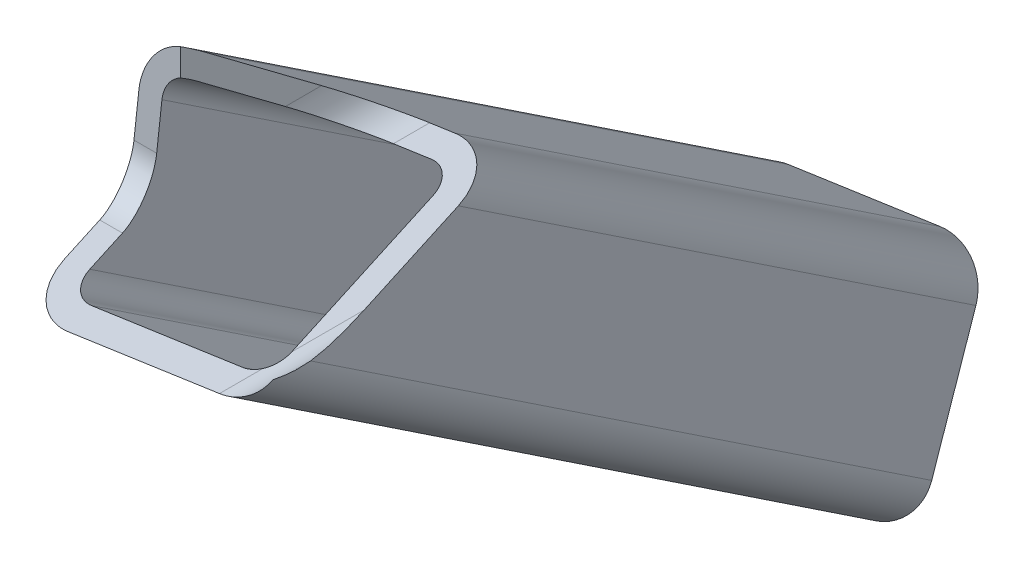
ISO-10303-21;
HEADER;
FILE_DESCRIPTION(('STEP AP214'),'2;1');
FILE_NAME('part.step','',(''),(''),'','','');
FILE_SCHEMA(('AUTOMOTIVE_DESIGN { 1 0 10303 214 1 1 1 1 }'));
ENDSEC;
DATA;
#1=APPLICATION_CONTEXT('core data for automotive mechanical design processes');
#2=APPLICATION_PROTOCOL_DEFINITION('international standard','automotive_design',2000,#1);
#3=PRODUCT_CONTEXT('',#1,'mechanical');
#4=PRODUCT('Part','Part','',(#3));
#5=PRODUCT_RELATED_PRODUCT_CATEGORY('part','',(#4));
#6=PRODUCT_DEFINITION_FORMATION('','',#4);
#7=PRODUCT_DEFINITION_CONTEXT('part definition',#1,'design');
#8=PRODUCT_DEFINITION('design','',#6,#7);
#9=PRODUCT_DEFINITION_SHAPE('','',#8);
#10=(LENGTH_UNIT() NAMED_UNIT(*) SI_UNIT(.MILLI.,.METRE.));
#11=(NAMED_UNIT(*) PLANE_ANGLE_UNIT() SI_UNIT($,.RADIAN.));
#12=(NAMED_UNIT(*) SI_UNIT($,.STERADIAN.) SOLID_ANGLE_UNIT());
#13=UNCERTAINTY_MEASURE_WITH_UNIT(LENGTH_MEASURE(1.E-05),#10,'distance_accuracy_value','');
#14=(GEOMETRIC_REPRESENTATION_CONTEXT(3) GLOBAL_UNCERTAINTY_ASSIGNED_CONTEXT((#13)) GLOBAL_UNIT_ASSIGNED_CONTEXT((#10,
#11,#12)) REPRESENTATION_CONTEXT('',''));
#15=CARTESIAN_POINT('',(0.,0.,0.));
#16=DIRECTION('',(0.,0.,1.));
#17=DIRECTION('',(1.,0.,0.));
#18=AXIS2_PLACEMENT_3D('',#15,#16,#17);
#19=CARTESIAN_POINT('',(143.018576029999,-3.96284793999886,-444.037152060001));
#20=DIRECTION('',(0.94907119849999,-0.101857603000022,-0.298142396999963));
#21=DIRECTION('',(-0.29970114592717,0.,-0.954033135236896));
#22=AXIS2_PLACEMENT_3D('',#19,#20,#21);
#23=PLANE('',#22);
#24=CARTESIAN_POINT('',(139.041918017913,-5.99999999999955,-456.));
#25=DIRECTION('',(0.94907119849999,-0.101857603000022,-0.298142396999963));
#26=DIRECTION('',(0.315061676783759,0.306829184502568,0.898104666149606));
#27=AXIS2_PLACEMENT_3D('',#24,#25,#26);
#28=ELLIPSE('',#27,4.21464691618714,4.);
#29=CARTESIAN_POINT('',(137.785353083812,-5.99999999999959,-460.));
#30=VERTEX_POINT('',#29);
#31=CARTESIAN_POINT('',(138.612624185538,-9.99999999999955,-456.));
#32=VERTEX_POINT('',#31);
#33=EDGE_CURVE('E220',#30,#32,#28,.F.);
#34=ORIENTED_EDGE('',*,*,#33,.T.);
#35=DIRECTION('',(0.29970114592717,0.,0.954033135236896));
#36=VECTOR('',#35,1.);
#37=CARTESIAN_POINT('',(142.428845393443,-9.99999999999943,-443.851893350385));
#38=LINE('',#37,#36);
#39=CARTESIAN_POINT('',(139.999999999999,-9.9999999999995,-451.583592135001));
#40=VERTEX_POINT('',#39);
#41=EDGE_CURVE('E228',#32,#40,#38,.T.);
#42=ORIENTED_EDGE('',*,*,#41,.T.);
#43=DIRECTION('',(-0.29814239699996,-0.596284793999952,-0.745355992499927));
#44=VECTOR('',#43,1.);
#45=CARTESIAN_POINT('',(143.018576029999,-3.96284793999886,-444.037152060001));
#46=LINE('',#45,#44);
#47=CARTESIAN_POINT('',(102.000000000001,-86.0000000000006,-546.583592135001));
#48=VERTEX_POINT('',#47);
#49=EDGE_CURVE('E335',#40,#48,#46,.T.);
#50=ORIENTED_EDGE('',*,*,#49,.T.);
#51=DIRECTION('',(0.,0.946298515400177,-0.323294169064988));
#52=VECTOR('',#51,1.);
#53=CARTESIAN_POINT('',(102.,-43.9096176049724,-560.963383480519));
#54=LINE('',#53,#52);
#55=CARTESIAN_POINT('',(102.000000000001,-74.0000000000007,-550.683281573));
#56=VERTEX_POINT('',#55);
#57=EDGE_CURVE('E343',#48,#56,#54,.T.);
#58=ORIENTED_EDGE('',*,*,#57,.T.);
#59=DIRECTION('',(-0.29814239699996,-0.596284793999952,-0.745355992499927));
#60=VECTOR('',#59,1.);
#61=CARTESIAN_POINT('',(141.796284793999,5.59256958800036,-451.192569588));
#62=LINE('',#61,#60);
#63=CARTESIAN_POINT('',(138.273312629199,-1.45337474159996,-460.));
#64=VERTEX_POINT('',#63);
#65=EDGE_CURVE('E344',#64,#56,#62,.T.);
#66=ORIENTED_EDGE('',*,*,#65,.F.);
#67=DIRECTION('',(-0.106710653684526,-0.994290116812101,0.));
#68=VECTOR('',#67,1.);
#69=CARTESIAN_POINT('',(138.06108923,-3.43079331316981,-460.));
#70=LINE('',#69,#68);
#71=EDGE_CURVE('E221',#64,#30,#70,.T.);
#72=ORIENTED_EDGE('',*,*,#71,.T.);
#73=EDGE_LOOP('',(#34,#42,#50,#58,#66,#72));
#74=FACE_BOUND('',#73,.T.);
#75=ADVANCED_FACE('F41',(#74),#23,.T.);
#76=CARTESIAN_POINT('',(144.916718426999,-4.16656314599899,-444.633436854001));
#77=DIRECTION('',(-0.29814239699996,-0.596284793999952,-0.745355992499927));
#78=DIRECTION('',(0.,0.780868809443026,-0.62469504755443));
#79=AXIS2_PLACEMENT_3D('',#76,#77,#78);
#80=CYLINDRICAL_SURFACE('',#79,2.);
#81=ORIENTED_EDGE('',*,*,#49,.F.);
#82=CARTESIAN_POINT('',(141.999999999999,-9.99999999999949,-451.925232921501));
#83=DIRECTION('',(0.,1.,0.));
#84=DIRECTION('',(-0.371390676354096,0.,-0.928476690885262));
#85=AXIS2_PLACEMENT_3D('',#82,#83,#84);
#86=ELLIPSE('',#85,3.35410196624969,2.);
#87=CARTESIAN_POINT('',(142.999999999999,-9.99999999999946,-448.741951348501));
#88=VERTEX_POINT('',#87);
#89=EDGE_CURVE('E234',#40,#88,#86,.T.);
#90=ORIENTED_EDGE('',*,*,#89,.T.);
#91=DIRECTION('',(-0.29814239699996,-0.596284793999952,-0.745355992499927));
#92=VECTOR('',#91,1.);
#93=CARTESIAN_POINT('',(145.120433632999,-5.75913273399889,-443.440867266001));
#94=LINE('',#93,#92);
#95=CARTESIAN_POINT('',(104.000000000001,-88.0000000000007,-546.241951348501));
#96=VERTEX_POINT('',#95);
#97=EDGE_CURVE('E327',#88,#96,#94,.T.);
#98=ORIENTED_EDGE('',*,*,#97,.T.);
#99=CARTESIAN_POINT('',(104.000000000001,-86.0000000000006,-546.925232921501));
#100=DIRECTION('',(-0.159575689721222,-0.319151379442473,-0.934172358962714));
#101=DIRECTION('',(-0.417774579468388,-0.835549158936788,0.356822089773093));
#102=AXIS2_PLACEMENT_3D('',#99,#100,#101);
#103=ELLIPSE('',#102,2.14093253863854,2.);
#104=EDGE_CURVE('E333',#96,#48,#103,.T.);
#105=ORIENTED_EDGE('',*,*,#104,.T.);
#106=EDGE_LOOP('',(#81,#90,#98,#105));
#107=FACE_BOUND('',#106,.T.);
#108=ADVANCED_FACE('F311',(#107),#80,.F.);
#109=CARTESIAN_POINT('',(145.120433632999,-5.75913273399889,-443.440867266001));
#110=DIRECTION('',(-0.10185760300003,0.796284793999938,-0.596284793999951));
#111=DIRECTION('',(0.,0.599402291854362,0.800447932422677));
#112=AXIS2_PLACEMENT_3D('',#109,#110,#111);
#113=PLANE('',#112);
#114=ORIENTED_EDGE('',*,*,#97,.F.);
#115=DIRECTION('',(0.985721919281303,0.,-0.168381405886707));
#116=VECTOR('',#115,1.);
#117=CARTESIAN_POINT('',(144.18045514836,-9.99999999999945,-448.943597161158));
#118=LINE('',#117,#116);
#119=CARTESIAN_POINT('',(154.999999999999,-9.99999999999933,-450.7917960675));
#120=VERTEX_POINT('',#119);
#121=EDGE_CURVE('E267',#88,#120,#118,.T.);
#122=ORIENTED_EDGE('',*,*,#121,.T.);
#123=DIRECTION('',(-0.29814239699996,-0.596284793999952,-0.745355992499927));
#124=VECTOR('',#123,1.);
#125=CARTESIAN_POINT('',(156.509288014999,-6.98142396999907,-447.01857603));
#126=LINE('',#125,#124);
#127=CARTESIAN_POINT('',(116.000000000001,-88.0000000000006,-548.2917960675));
#128=VERTEX_POINT('',#127);
#129=EDGE_CURVE('E337',#120,#128,#126,.T.);
#130=ORIENTED_EDGE('',*,*,#129,.T.);
#131=DIRECTION('',(-0.985721919281303,0.,0.168381405886707));
#132=VECTOR('',#131,1.);
#133=CARTESIAN_POINT('',(126.891934380536,-88.0000000000006,-550.152360581636));
#134=LINE('',#133,#132);
#135=EDGE_CURVE('E330',#128,#96,#134,.T.);
#136=ORIENTED_EDGE('',*,*,#135,.T.);
#137=EDGE_LOOP('',(#114,#122,#130,#136));
#138=FACE_BOUND('',#137,.T.);
#139=ADVANCED_FACE('F314',(#138),#113,.T.);
#140=CARTESIAN_POINT('',(143.694427190999,5.38885438200044,-451.788854382));
#141=DIRECTION('',(-0.29814239699996,-0.596284793999952,-0.745355992499927));
#142=DIRECTION('',(0.,0.780868809443026,-0.62469504755443));
#143=AXIS2_PLACEMENT_3D('',#140,#141,#142);
#144=CYLINDRICAL_SURFACE('',#143,2.);
#145=CARTESIAN_POINT('',(139.999999999999,-1.99999999999939,-461.0249223595));
#146=DIRECTION('',(1.,0.,0.));
#147=DIRECTION('',(0.,-0.62469504755443,-0.780868809443026));
#148=AXIS2_PLACEMENT_3D('',#145,#146,#147);
#149=ELLIPSE('',#148,6.70820393249939,2.);
#150=CARTESIAN_POINT('',(139.999999999999,3.88578058618805E-13,-461.7082039325));
#151=VERTEX_POINT('',#150);
#152=CARTESIAN_POINT('',(139.999999999999,1.15266891727499,-460.));
#153=VERTEX_POINT('',#152);
#154=EDGE_CURVE('E296',#151,#153,#149,.T.);
#155=ORIENTED_EDGE('',*,*,#154,.T.);
#156=CARTESIAN_POINT('',(140.409968943799,-1.18006211239989,-460.));
#157=DIRECTION('',(0.,0.,1.));
#158=DIRECTION('',(-0.447213595499949,-0.89442719099992,0.));
#159=AXIS2_PLACEMENT_3D('',#156,#157,#158);
#160=ELLIPSE('',#159,2.68328157299975,2.);
#161=EDGE_CURVE('E247',#153,#64,#160,.T.);
#162=ORIENTED_EDGE('',*,*,#161,.T.);
#163=ORIENTED_EDGE('',*,*,#65,.T.);
#164=CARTESIAN_POINT('',(104.000000000001,-74.0000000000006,-551.0249223595));
#165=DIRECTION('',(-0.159575689721222,-0.319151379442473,-0.934172358962714));
#166=DIRECTION('',(-0.417774579468388,-0.835549158936788,0.356822089773093));
#167=AXIS2_PLACEMENT_3D('',#164,#165,#166);
#168=ELLIPSE('',#167,2.14093253863854,2.);
#169=CARTESIAN_POINT('',(104.000000000001,-72.0000000000007,-551.708203932499));
#170=VERTEX_POINT('',#169);
#171=EDGE_CURVE('E346',#56,#170,#168,.T.);
#172=ORIENTED_EDGE('',*,*,#171,.T.);
#173=DIRECTION('',(-0.29814239699996,-0.596284793999952,-0.745355992499927));
#174=VECTOR('',#173,1.);
#175=CARTESIAN_POINT('',(143.490711984999,6.98142397000013,-452.98142397));
#176=LINE('',#175,#174);
#177=EDGE_CURVE('E64',#151,#170,#176,.T.);
#178=ORIENTED_EDGE('',*,*,#177,.F.);
#179=EDGE_LOOP('',(#155,#162,#163,#172,#178));
#180=FACE_BOUND('',#179,.T.);
#181=ADVANCED_FACE('F317',(#180),#144,.F.);
#182=CARTESIAN_POINT('',(144.916718426999,-4.16656314599899,-444.633436854001));
#183=DIRECTION('',(-0.29814239699996,-0.596284793999952,-0.745355992499927));
#184=DIRECTION('',(0.,0.780868809443026,-0.62469504755443));
#185=AXIS2_PLACEMENT_3D('',#182,#183,#184);
#186=CYLINDRICAL_SURFACE('',#185,4.);
#187=CARTESIAN_POINT('',(141.999999999999,-9.99999999999949,-451.925232921501));
#188=DIRECTION('',(0.,1.,0.));
#189=DIRECTION('',(-0.371390676354096,0.,-0.928476690885262));
#190=AXIS2_PLACEMENT_3D('',#187,#188,#189);
#191=ELLIPSE('',#190,6.70820393249937,4.);
#192=CARTESIAN_POINT('',(137.999999999999,-9.99999999999952,-451.241951348501));
#193=VERTEX_POINT('',#192);
#194=CARTESIAN_POINT('',(143.999999999999,-9.99999999999942,-445.558669775502));
#195=VERTEX_POINT('',#194);
#196=EDGE_CURVE('E235',#193,#195,#191,.T.);
#197=ORIENTED_EDGE('',*,*,#196,.F.);
#198=DIRECTION('',(-0.29814239699996,-0.596284793999952,-0.745355992499927));
#199=VECTOR('',#198,1.);
#200=CARTESIAN_POINT('',(141.120433632999,-3.75913273399892,-443.440867266001));
#201=LINE('',#200,#199);
#202=CARTESIAN_POINT('',(100.000000000001,-86.0000000000007,-546.241951348501));
#203=VERTEX_POINT('',#202);
#204=EDGE_CURVE('E233',#193,#203,#201,.T.);
#205=ORIENTED_EDGE('',*,*,#204,.T.);
#206=CARTESIAN_POINT('',(104.000000000001,-86.0000000000006,-546.925232921501));
#207=DIRECTION('',(-0.159575689721222,-0.319151379442473,-0.934172358962714));
#208=DIRECTION('',(-0.417774579468388,-0.835549158936788,0.356822089773093));
#209=AXIS2_PLACEMENT_3D('',#206,#207,#208);
#210=ELLIPSE('',#209,4.28186507727708,4.);
#211=CARTESIAN_POINT('',(104.000000000001,-90.0000000000006,-545.558669775501));
#212=VERTEX_POINT('',#211);
#213=EDGE_CURVE('E359',#212,#203,#210,.T.);
#214=ORIENTED_EDGE('',*,*,#213,.F.);
#215=DIRECTION('',(-0.29814239699996,-0.596284793999952,-0.745355992499927));
#216=VECTOR('',#215,1.);
#217=CARTESIAN_POINT('',(145.324148838999,-7.35170232199857,-442.248297678001));
#218=LINE('',#217,#216);
#219=EDGE_CURVE('E108',#195,#212,#218,.T.);
#220=ORIENTED_EDGE('',*,*,#219,.F.);
#221=EDGE_LOOP('',(#197,#205,#214,#220));
#222=FACE_BOUND('',#221,.T.);
#223=ADVANCED_FACE('F322',(#222),#186,.T.);
#224=CARTESIAN_POINT('',(141.120433632999,-3.75913273399892,-443.440867266001));
#225=DIRECTION('',(0.94907119849999,-0.101857603000022,-0.298142396999963));
#226=DIRECTION('',(-0.29970114592717,0.,-0.954033135236896));
#227=AXIS2_PLACEMENT_3D('',#224,#225,#226);
#228=PLANE('',#227);
#229=DIRECTION('',(0.29970114592717,0.,0.954033135236896));
#230=VECTOR('',#229,1.);
#231=CARTESIAN_POINT('',(140.510803365472,-9.99999999999945,-443.249357261765));
#232=LINE('',#231,#230);
#233=CARTESIAN_POINT('',(136.505300727445,-9.99999999999957,-456.));
#234=VERTEX_POINT('',#233);
#235=EDGE_CURVE('E225',#234,#193,#232,.T.);
#236=ORIENTED_EDGE('',*,*,#235,.F.);
#237=CARTESIAN_POINT('',(136.934594559819,-5.99999999999956,-456.));
#238=DIRECTION('',(0.94907119849999,-0.101857603000022,-0.298142396999963));
#239=DIRECTION('',(0.315061676783759,0.306829184502568,0.898104666149606));
#240=AXIS2_PLACEMENT_3D('',#237,#238,#239);
#241=ELLIPSE('',#240,4.21464691618714,4.);
#242=CARTESIAN_POINT('',(135.678029625718,-5.9999999999996,-460.));
#243=VERTEX_POINT('',#242);
#244=EDGE_CURVE('E210',#243,#234,#241,.F.);
#245=ORIENTED_EDGE('',*,*,#244,.F.);
#246=DIRECTION('',(-0.106710653684526,-0.994290116812101,0.));
#247=VECTOR('',#246,1.);
#248=CARTESIAN_POINT('',(135.977762208902,-3.20720345292599,-460.));
#249=LINE('',#248,#247);
#250=CARTESIAN_POINT('',(136.136656314599,-1.7266873707998,-460.));
#251=VERTEX_POINT('',#250);
#252=EDGE_CURVE('E245',#251,#243,#249,.T.);
#253=ORIENTED_EDGE('',*,*,#252,.F.);
#254=DIRECTION('',(-0.29814239699996,-0.596284793999952,-0.745355992499927));
#255=VECTOR('',#254,1.);
#256=CARTESIAN_POINT('',(139.898142396999,5.7962847940005,-450.596284794));
#257=LINE('',#256,#255);
#258=CARTESIAN_POINT('',(100.000000000001,-74.0000000000007,-550.3416407865));
#259=VERTEX_POINT('',#258);
#260=EDGE_CURVE('E398',#251,#259,#257,.T.);
#261=ORIENTED_EDGE('',*,*,#260,.T.);
#262=DIRECTION('',(0.,0.946298515400177,-0.323294169064988));
#263=VECTOR('',#262,1.);
#264=CARTESIAN_POINT('',(100.,-43.8050984852211,-560.657450688296));
#265=LINE('',#264,#263);
#266=EDGE_CURVE('E353',#203,#259,#265,.T.);
#267=ORIENTED_EDGE('',*,*,#266,.F.);
#268=ORIENTED_EDGE('',*,*,#204,.F.);
#269=EDGE_LOOP('',(#236,#245,#253,#261,#267,#268));
#270=FACE_BOUND('',#269,.T.);
#271=ADVANCED_FACE('F231',(#270),#228,.F.);
#272=CARTESIAN_POINT('',(143.694427190999,5.38885438200044,-451.788854382));
#273=DIRECTION('',(-0.29814239699996,-0.596284793999952,-0.745355992499927));
#274=DIRECTION('',(0.,0.780868809443026,-0.62469504755443));
#275=AXIS2_PLACEMENT_3D('',#272,#273,#274);
#276=CYLINDRICAL_SURFACE('',#275,4.);
#277=CARTESIAN_POINT('',(140.409968943799,-1.18006211239989,-460.));
#278=DIRECTION('',(0.,0.,1.));
#279=DIRECTION('',(-0.447213595499949,-0.89442719099992,0.));
#280=AXIS2_PLACEMENT_3D('',#277,#278,#279);
#281=ELLIPSE('',#280,5.3665631459995,4.);
#282=CARTESIAN_POINT('',(139.999999999999,3.66695933993934,-460.));
#283=VERTEX_POINT('',#282);
#284=EDGE_CURVE('E243',#283,#251,#281,.T.);
#285=ORIENTED_EDGE('',*,*,#284,.F.);
#286=CARTESIAN_POINT('',(139.999999999999,-1.99999999999939,-461.0249223595));
#287=DIRECTION('',(1.,0.,0.));
#288=DIRECTION('',(0.,-0.62469504755443,-0.780868809443026));
#289=AXIS2_PLACEMENT_3D('',#286,#287,#288);
#290=ELLIPSE('',#289,13.4164078649988,4.);
#291=CARTESIAN_POINT('',(139.999999999999,2.00000000000038,-462.391485505499));
#292=VERTEX_POINT('',#291);
#293=EDGE_CURVE('E461',#292,#283,#290,.T.);
#294=ORIENTED_EDGE('',*,*,#293,.F.);
#295=DIRECTION('',(-0.29814239699996,-0.596284793999952,-0.745355992499927));
#296=VECTOR('',#295,1.);
#297=CARTESIAN_POINT('',(143.286996778999,8.57399355800002,-454.173993558));
#298=LINE('',#297,#296);
#299=CARTESIAN_POINT('',(104.000000000001,-70.0000000000008,-552.391485505499));
#300=VERTEX_POINT('',#299);
#301=EDGE_CURVE('E395',#292,#300,#298,.T.);
#302=ORIENTED_EDGE('',*,*,#301,.T.);
#303=CARTESIAN_POINT('',(104.000000000001,-74.0000000000006,-551.0249223595));
#304=DIRECTION('',(-0.159575689721222,-0.319151379442473,-0.934172358962714));
#305=DIRECTION('',(-0.417774579468388,-0.835549158936788,0.356822089773093));
#306=AXIS2_PLACEMENT_3D('',#303,#304,#305);
#307=ELLIPSE('',#306,4.28186507727708,4.);
#308=EDGE_CURVE('E348',#259,#300,#307,.T.);
#309=ORIENTED_EDGE('',*,*,#308,.F.);
#310=ORIENTED_EDGE('',*,*,#260,.F.);
#311=EDGE_LOOP('',(#285,#294,#302,#309,#310));
#312=FACE_BOUND('',#311,.T.);
#313=ADVANCED_FACE('F458',(#312),#276,.T.);
#314=CARTESIAN_POINT('',(140.000000000002,5.99999999999772,-825.));
#315=DIRECTION('',(1.,0.,0.));
#316=DIRECTION('',(0.,0.,-1.));
#317=AXIS2_PLACEMENT_3D('',#314,#315,#316);
#318=PLANE('',#317);
#319=ORIENTED_EDGE('',*,*,#293,.T.);
#320=DIRECTION('',(0.,-1.,0.));
#321=VECTOR('',#320,1.);
#322=CARTESIAN_POINT('',(139.999999999999,6.00000000000045,-460.));
#323=LINE('',#322,#321);
#324=EDGE_CURVE('E11',#283,#153,#323,.T.);
#325=ORIENTED_EDGE('',*,*,#324,.T.);
#326=ORIENTED_EDGE('',*,*,#154,.F.);
#327=DIRECTION('',(0.,0.599402291854362,0.800447932422677));
#328=VECTOR('',#327,1.);
#329=CARTESIAN_POINT('',(139.999999999999,4.53963364989105,-455.645930867494));
#330=LINE('',#329,#328);
#331=CARTESIAN_POINT('',(139.999999999999,-5.99999999999963,-469.720665112249));
#332=VERTEX_POINT('',#331);
#333=EDGE_CURVE('E463',#332,#151,#330,.T.);
#334=ORIENTED_EDGE('',*,*,#333,.F.);
#335=DIRECTION('',(0.,0.,1.));
#336=VECTOR('',#335,1.);
#337=CARTESIAN_POINT('',(140.000000000002,-6.0000000000023,-825.));
#338=LINE('',#337,#336);
#339=CARTESIAN_POINT('',(139.999999999999,-5.99999999999964,-473.074767078499));
#340=VERTEX_POINT('',#339);
#341=EDGE_CURVE('E253',#340,#332,#338,.T.);
#342=ORIENTED_EDGE('',*,*,#341,.F.);
#343=DIRECTION('',(0.,0.599402291854362,0.800447932422677));
#344=VECTOR('',#343,1.);
#345=CARTESIAN_POINT('',(139.999999999999,6.14889932304617,-456.851003044734));
#346=LINE('',#345,#344);
#347=EDGE_CURVE('E437',#340,#292,#346,.T.);
#348=ORIENTED_EDGE('',*,*,#347,.T.);
#349=EDGE_LOOP('',(#319,#325,#326,#334,#342,#348));
#350=FACE_BOUND('',#349,.T.);
#351=ADVANCED_FACE('F467',(#350),#318,.T.);
#352=CARTESIAN_POINT('',(156.305572808999,-5.38885438199918,-448.211145618));
#353=DIRECTION('',(-0.29814239699996,-0.596284793999952,-0.745355992499927));
#354=DIRECTION('',(0.,0.780868809443026,-0.62469504755443));
#355=AXIS2_PLACEMENT_3D('',#352,#353,#354);
#356=CYLINDRICAL_SURFACE('',#355,2.);
#357=CARTESIAN_POINT('',(153.999999999999,-9.99999999999939,-453.9750776405));
#358=DIRECTION('',(0.,1.,0.));
#359=DIRECTION('',(-0.371390676354096,0.,-0.928476690885262));
#360=AXIS2_PLACEMENT_3D('',#357,#358,#359);
#361=ELLIPSE('',#360,3.35410196624969,2.);
#362=CARTESIAN_POINT('',(155.999999999999,-9.99999999999936,-451.633436854));
#363=VERTEX_POINT('',#362);
#364=EDGE_CURVE('E270',#120,#363,#361,.T.);
#365=ORIENTED_EDGE('',*,*,#364,.T.);
#366=CARTESIAN_POINT('',(155.999999999999,-9.99999999999936,-451.633436854));
#367=CARTESIAN_POINT('',(156.03591201834,-9.99996142837952,-451.711793190897));
#368=CARTESIAN_POINT('',(156.067259781264,-9.99951647332164,-451.792112938987));
#369=CARTESIAN_POINT('',(156.121412114332,-9.99825837124838,-451.955341523659));
#370=CARTESIAN_POINT('',(156.144240934134,-9.99744628411695,-452.038242272018));
#371=CARTESIAN_POINT('',(156.181937809571,-9.9959014467898,-452.204867708711));
#372=CARTESIAN_POINT('',(156.196887844746,-9.99516794553557,-452.288574293103));
#373=CARTESIAN_POINT('',(156.219968393148,-9.99396410249764,-452.456974533567));
#374=CARTESIAN_POINT('',(156.228093004083,-9.99349398859521,-452.541668979867));
#375=CARTESIAN_POINT('',(156.240254773992,-9.99278540542814,-452.745289809075));
#376=CARTESIAN_POINT('',(156.241367468857,-9.99271421212924,-452.864390901013));
#377=CARTESIAN_POINT('',(156.23335638771,-9.9931881962528,-453.102228722222));
#378=CARTESIAN_POINT('',(156.224229077634,-9.99373358647304,-453.220965311509));
#379=CARTESIAN_POINT('',(156.196994023183,-9.99516941019323,-453.457887806276));
#380=CARTESIAN_POINT('',(156.178848318303,-9.99606129868996,-453.576069233935));
#381=CARTESIAN_POINT('',(156.134502730167,-9.99779954122553,-453.810850243259));
#382=CARTESIAN_POINT('',(156.108306538892,-9.99864591592853,-453.927450524502));
#383=CARTESIAN_POINT('',(156.06645803235,-9.99946547853923,-454.089082340905));
#384=CARTESIAN_POINT('',(156.05395025648,-9.99965760678938,-454.134947266496));
#385=CARTESIAN_POINT('',(156.027815874046,-9.99992452627933,-454.226172067096));
#386=CARTESIAN_POINT('',(156.014193625858,-9.99999975357614,-454.271533189319));
#387=CARTESIAN_POINT('',(155.999999999999,-9.99999999999938,-454.316718427));
#388=B_SPLINE_CURVE_WITH_KNOTS('',3,(#366,#367,#368,#369,#370,#371,#372,#373,#374,#375,#376,
#377,#378,#379,#380,#381,#382,#383,#384,#385,#386,#387),.UNSPECIFIED.,.F.,.F.,(4,2,2,2,2,2,2,2,
2,2,4),(0.,0.258270532872217,0.515800172061258,0.770594469002367,1.02560887345454,
1.38237703092867,1.73926835526132,2.09767480488864,2.45591713273812,2.5985257643496,
2.74060115777448),.UNSPECIFIED.);
#389=CARTESIAN_POINT('',(155.999999999999,-9.99999999999938,-454.316718427));
#390=VERTEX_POINT('',#389);
#391=EDGE_CURVE('E287',#363,#390,#388,.T.);
#392=ORIENTED_EDGE('',*,*,#391,.T.);
#393=DIRECTION('',(-0.29814239699996,-0.596284793999952,-0.745355992499927));
#394=VECTOR('',#393,1.);
#395=CARTESIAN_POINT('',(158.203715205999,-5.59256958799931,-448.807430412));
#396=LINE('',#395,#394);
#397=CARTESIAN_POINT('',(118.000000000001,-86.0000000000006,-549.316718427));
#398=VERTEX_POINT('',#397);
#399=EDGE_CURVE('E386',#390,#398,#396,.T.);
#400=ORIENTED_EDGE('',*,*,#399,.T.);
#401=CARTESIAN_POINT('',(116.000000000001,-86.0000000000005,-548.9750776405));
#402=DIRECTION('',(-0.159575689721222,-0.319151379442473,-0.934172358962714));
#403=DIRECTION('',(-0.417774579468388,-0.835549158936788,0.356822089773093));
#404=AXIS2_PLACEMENT_3D('',#401,#402,#403);
#405=ELLIPSE('',#404,2.14093253863854,2.);
#406=EDGE_CURVE('E387',#398,#128,#405,.T.);
#407=ORIENTED_EDGE('',*,*,#406,.T.);
#408=ORIENTED_EDGE('',*,*,#129,.F.);
#409=EDGE_LOOP('',(#365,#392,#400,#407,#408));
#410=FACE_BOUND('',#409,.T.);
#411=ADVANCED_FACE('F298',(#410),#356,.F.);
#412=CARTESIAN_POINT('',(156.981423969999,3.96284794000012,-455.96284794));
#413=DIRECTION('',(-0.94907119849999,0.101857603000022,0.298142396999963));
#414=DIRECTION('',(0.29970114592717,0.,0.954033135236896));
#415=AXIS2_PLACEMENT_3D('',#412,#413,#414);
#416=PLANE('',#415);
#417=ORIENTED_EDGE('',*,*,#399,.F.);
#418=DIRECTION('',(-0.29970114592717,0.,-0.954033135236896));
#419=VECTOR('',#418,1.);
#420=CARTESIAN_POINT('',(155.617482972331,-9.9999999999994,-455.534377832536));
#421=LINE('',#420,#419);
#422=CARTESIAN_POINT('',(149.999999999999,-9.99999999999956,-473.416407864999));
#423=VERTEX_POINT('',#422);
#424=EDGE_CURVE('E273',#390,#423,#421,.T.);
#425=ORIENTED_EDGE('',*,*,#424,.T.);
#426=DIRECTION('',(-0.29814239699996,-0.596284793999952,-0.745355992499927));
#427=VECTOR('',#426,1.);
#428=CARTESIAN_POINT('',(156.981423969999,3.96284794000012,-455.96284794));
#429=LINE('',#428,#427);
#430=CARTESIAN_POINT('',(118.000000000001,-74.0000000000005,-553.416407864999));
#431=VERTEX_POINT('',#430);
#432=EDGE_CURVE('E382',#423,#431,#429,.T.);
#433=ORIENTED_EDGE('',*,*,#432,.T.);
#434=DIRECTION('',(0.,-0.946298515400177,0.323294169064988));
#435=VECTOR('',#434,1.);
#436=CARTESIAN_POINT('',(118.,-34.0000000000005,-567.082039324994));
#437=LINE('',#436,#435);
#438=EDGE_CURVE('E383',#431,#398,#437,.T.);
#439=ORIENTED_EDGE('',*,*,#438,.T.);
#440=EDGE_LOOP('',(#417,#425,#433,#439));
#441=FACE_BOUND('',#440,.T.);
#442=ADVANCED_FACE('F416',(#441),#416,.T.);
#443=CARTESIAN_POINT('',(155.083281572999,4.16656314600003,-455.366563146));
#444=DIRECTION('',(-0.29814239699996,-0.596284793999952,-0.745355992499927));
#445=DIRECTION('',(0.,0.780868809443026,-0.62469504755443));
#446=AXIS2_PLACEMENT_3D('',#443,#444,#445);
#447=CYLINDRICAL_SURFACE('',#446,2.);
#448=ORIENTED_EDGE('',*,*,#432,.F.);
#449=CARTESIAN_POINT('',(147.999999999999,-9.9999999999996,-473.074767078499));
#450=DIRECTION('',(0.,1.,0.));
#451=DIRECTION('',(-0.371390676354096,0.,-0.928476690885262));
#452=AXIS2_PLACEMENT_3D('',#449,#450,#451);
#453=ELLIPSE('',#452,3.35410196624969,2.);
#454=CARTESIAN_POINT('',(146.999999999999,-9.99999999999963,-476.258048651499));
#455=VERTEX_POINT('',#454);
#456=EDGE_CURVE('E275',#423,#455,#453,.T.);
#457=ORIENTED_EDGE('',*,*,#456,.T.);
#458=DIRECTION('',(-0.29814239699996,-0.596284793999952,-0.745355992499927));
#459=VECTOR('',#458,1.);
#460=CARTESIAN_POINT('',(154.879566366999,5.75913273399993,-456.559132734));
#461=LINE('',#460,#459);
#462=CARTESIAN_POINT('',(116.000000000001,-72.0000000000006,-553.758048651499));
#463=VERTEX_POINT('',#462);
#464=EDGE_CURVE('E378',#455,#463,#461,.T.);
#465=ORIENTED_EDGE('',*,*,#464,.T.);
#466=CARTESIAN_POINT('',(116.000000000001,-74.0000000000006,-553.074767078499));
#467=DIRECTION('',(-0.159575689721222,-0.319151379442473,-0.934172358962714));
#468=DIRECTION('',(-0.417774579468388,-0.835549158936788,0.356822089773093));
#469=AXIS2_PLACEMENT_3D('',#466,#467,#468);
#470=ELLIPSE('',#469,2.14093253863854,2.);
#471=EDGE_CURVE('E379',#463,#431,#470,.T.);
#472=ORIENTED_EDGE('',*,*,#471,.T.);
#473=EDGE_LOOP('',(#448,#457,#465,#472));
#474=FACE_BOUND('',#473,.T.);
#475=ADVANCED_FACE('F421',(#474),#447,.F.);
#476=CARTESIAN_POINT('',(154.879566366999,5.75913273399993,-456.559132734));
#477=DIRECTION('',(0.10185760300003,-0.796284793999938,0.596284793999951));
#478=DIRECTION('',(0.,-0.599402291854362,-0.800447932422677));
#479=AXIS2_PLACEMENT_3D('',#476,#477,#478);
#480=PLANE('',#479);
#481=ORIENTED_EDGE('',*,*,#464,.F.);
#482=DIRECTION('',(-0.985721919281303,0.,0.168381405886707));
#483=VECTOR('',#482,1.);
#484=CARTESIAN_POINT('',(151.386590808606,-9.99999999999959,-477.007367818451));
#485=LINE('',#484,#483);
#486=CARTESIAN_POINT('',(143.999999999999,-9.99999999999965,-475.745587471749));
#487=VERTEX_POINT('',#486);
#488=EDGE_CURVE('E278',#455,#487,#485,.T.);
#489=ORIENTED_EDGE('',*,*,#488,.T.);
#490=CARTESIAN_POINT('',(143.999999999999,-5.9999999999996,-470.403946685249));
#491=DIRECTION('',(0.10185760300003,-0.796284793999938,0.596284793999951));
#492=DIRECTION('',(-0.0756579281399874,0.59146549642826,0.802772971919481));
#493=AXIS2_PLACEMENT_3D('',#490,#491,#492);
#494=ELLIPSE('',#493,6.70820393249937,4.);
#495=EDGE_CURVE('E425',#487,#332,#494,.F.);
#496=ORIENTED_EDGE('',*,*,#495,.T.);
#497=ORIENTED_EDGE('',*,*,#333,.T.);
#498=ORIENTED_EDGE('',*,*,#177,.T.);
#499=DIRECTION('',(0.985721919281303,0.,-0.168381405886707));
#500=VECTOR('',#499,1.);
#501=CARTESIAN_POINT('',(137.644433275207,-72.0000000000004,-557.455359255241));
#502=LINE('',#501,#500);
#503=EDGE_CURVE('E376',#170,#463,#502,.T.);
#504=ORIENTED_EDGE('',*,*,#503,.T.);
#505=EDGE_LOOP('',(#481,#489,#496,#497,#498,#504));
#506=FACE_BOUND('',#505,.T.);
#507=ADVANCED_FACE('F423',(#506),#480,.T.);
#508=CARTESIAN_POINT('',(110.000000000001,-80.0000000000005,-550.));
#509=DIRECTION('',(-0.159575689721222,-0.319151379442473,-0.934172358962714));
#510=DIRECTION('',(0.,0.946298515400177,-0.323294169064988));
#511=AXIS2_PLACEMENT_3D('',#508,#509,#510);
#512=PLANE('',#511);
#513=ORIENTED_EDGE('',*,*,#171,.F.);
#514=ORIENTED_EDGE('',*,*,#57,.F.);
#515=ORIENTED_EDGE('',*,*,#104,.F.);
#516=ORIENTED_EDGE('',*,*,#135,.F.);
#517=ORIENTED_EDGE('',*,*,#406,.F.);
#518=ORIENTED_EDGE('',*,*,#438,.F.);
#519=ORIENTED_EDGE('',*,*,#471,.F.);
#520=ORIENTED_EDGE('',*,*,#503,.F.);
#521=EDGE_LOOP('',(#513,#514,#515,#516,#517,#518,#519,#520));
#522=FACE_BOUND('',#521,.T.);
#523=DIRECTION('',(0.985721919281303,0.,-0.168381405886707));
#524=VECTOR('',#523,1.);
#525=CARTESIAN_POINT('',(137.531024083813,-70.0000000000005,-558.119268225569));
#526=LINE('',#525,#524);
#527=CARTESIAN_POINT('',(116.000000000001,-70.0000000000006,-554.441330224498));
#528=VERTEX_POINT('',#527);
#529=EDGE_CURVE('E362',#300,#528,#526,.T.);
#530=ORIENTED_EDGE('',*,*,#529,.T.);
#531=CARTESIAN_POINT('',(116.000000000001,-74.0000000000006,-553.074767078499));
#532=DIRECTION('',(-0.159575689721222,-0.319151379442473,-0.934172358962714));
#533=DIRECTION('',(-0.417774579468388,-0.835549158936788,0.356822089773093));
#534=AXIS2_PLACEMENT_3D('',#531,#532,#533);
#535=ELLIPSE('',#534,4.28186507727708,4.);
#536=CARTESIAN_POINT('',(120.000000000001,-74.0000000000005,-553.758048651499));
#537=VERTEX_POINT('',#536);
#538=EDGE_CURVE('E392',#528,#537,#535,.T.);
#539=ORIENTED_EDGE('',*,*,#538,.T.);
#540=DIRECTION('',(0.,-0.946298515400177,0.323294169064988));
#541=VECTOR('',#540,1.);
#542=CARTESIAN_POINT('',(120.,-34.104519119752,-567.387972117218));
#543=LINE('',#542,#541);
#544=CARTESIAN_POINT('',(120.000000000001,-86.0000000000006,-549.6583592135));
#545=VERTEX_POINT('',#544);
#546=EDGE_CURVE('E373',#537,#545,#543,.T.);
#547=ORIENTED_EDGE('',*,*,#546,.T.);
#548=CARTESIAN_POINT('',(116.000000000001,-86.0000000000005,-548.9750776405));
#549=DIRECTION('',(-0.159575689721222,-0.319151379442473,-0.934172358962714));
#550=DIRECTION('',(-0.417774579468388,-0.835549158936788,0.356822089773093));
#551=AXIS2_PLACEMENT_3D('',#548,#549,#550);
#552=ELLIPSE('',#551,4.28186507727708,4.);
#553=CARTESIAN_POINT('',(116.000000000001,-90.0000000000005,-547.608514494501));
#554=VERTEX_POINT('',#553);
#555=EDGE_CURVE('E370',#545,#554,#552,.T.);
#556=ORIENTED_EDGE('',*,*,#555,.T.);
#557=DIRECTION('',(-0.985721919281303,0.,0.168381405886707));
#558=VECTOR('',#557,1.);
#559=CARTESIAN_POINT('',(127.00534357193,-90.0000000000004,-549.488451611308));
#560=LINE('',#559,#558);
#561=EDGE_CURVE('E367',#554,#212,#560,.T.);
#562=ORIENTED_EDGE('',*,*,#561,.T.);
#563=ORIENTED_EDGE('',*,*,#213,.T.);
#564=ORIENTED_EDGE('',*,*,#266,.T.);
#565=ORIENTED_EDGE('',*,*,#308,.T.);
#566=EDGE_LOOP('',(#530,#539,#547,#556,#562,#563,#564,#565));
#567=FACE_BOUND('',#566,.T.);
#568=ADVANCED_FACE('F43',(#522,#567),#512,.T.);
#569=CARTESIAN_POINT('',(158.879566366999,3.75913273399996,-456.559132734));
#570=DIRECTION('',(-0.94907119849999,0.101857603000022,0.298142396999963));
#571=DIRECTION('',(0.29970114592717,0.,0.954033135236896));
#572=AXIS2_PLACEMENT_3D('',#569,#570,#571);
#573=PLANE('',#572);
#574=CARTESIAN_POINT('',(155.999999999999,-5.99999999999944,-462.391485505499));
#575=DIRECTION('',(-0.94907119849999,0.101857603000022,0.298142396999963));
#576=DIRECTION('',(0.296440038739734,-0.0318149700749313,0.954521404218426));
#577=AXIS2_PLACEMENT_3D('',#574,#575,#576);
#578=ELLIPSE('',#577,13.4164078649988,4.);
#579=CARTESIAN_POINT('',(158.399999999999,-9.19999999999924,-453.6583592135));
#580=VERTEX_POINT('',#579);
#581=CARTESIAN_POINT('',(156.,-9.99999999999944,-461.024922359498));
#582=VERTEX_POINT('',#581);
#583=EDGE_CURVE('E49',#580,#582,#578,.F.);
#584=ORIENTED_EDGE('',*,*,#583,.F.);
#585=DIRECTION('',(-0.29814239699996,-0.596284793999952,-0.745355992499927));
#586=VECTOR('',#585,1.);
#587=CARTESIAN_POINT('',(160.101857602999,-5.79628479399925,-449.403715206));
#588=LINE('',#587,#586);
#589=EDGE_CURVE('E92',#580,#545,#588,.T.);
#590=ORIENTED_EDGE('',*,*,#589,.T.);
#591=ORIENTED_EDGE('',*,*,#546,.F.);
#592=DIRECTION('',(-0.29814239699996,-0.596284793999952,-0.745355992499927));
#593=VECTOR('',#592,1.);
#594=CARTESIAN_POINT('',(158.879566366999,3.75913273399996,-456.559132734));
#595=LINE('',#594,#593);
#596=CARTESIAN_POINT('',(151.999999999999,-9.99999999999956,-473.758048651499));
#597=VERTEX_POINT('',#596);
#598=EDGE_CURVE('E396',#597,#537,#595,.T.);
#599=ORIENTED_EDGE('',*,*,#598,.F.);
#600=DIRECTION('',(-0.29970114592717,0.,-0.954033135236896));
#601=VECTOR('',#600,1.);
#602=CARTESIAN_POINT('',(157.535525000302,-9.99999999999938,-456.136913921156));
#603=LINE('',#602,#601);
#604=EDGE_CURVE('E347',#582,#597,#603,.T.);
#605=ORIENTED_EDGE('',*,*,#604,.F.);
#606=EDGE_LOOP('',(#584,#590,#591,#599,#605));
#607=FACE_BOUND('',#606,.T.);
#608=ADVANCED_FACE('F449',(#607),#573,.F.);
#609=CARTESIAN_POINT('',(156.305572808999,-5.38885438199918,-448.211145618));
#610=DIRECTION('',(-0.29814239699996,-0.596284793999952,-0.745355992499927));
#611=DIRECTION('',(0.,0.780868809443026,-0.62469504755443));
#612=AXIS2_PLACEMENT_3D('',#609,#610,#611);
#613=CYLINDRICAL_SURFACE('',#612,4.);
#614=CARTESIAN_POINT('',(155.999999999999,-5.99999999999932,-448.9750776405));
#615=DIRECTION('',(-0.417774579468388,-0.835549158936788,0.356822089773093));
#616=DIRECTION('',(-0.159575689721222,-0.319151379442473,-0.934172358962714));
#617=AXIS2_PLACEMENT_3D('',#614,#615,#616);
#618=ELLIPSE('',#617,11.2100683075526,4.);
#619=CARTESIAN_POINT('',(159.577708763999,-7.78885438199912,-448.9750776405));
#620=VERTEX_POINT('',#619);
#621=EDGE_CURVE('E283',#620,#580,#618,.F.);
#622=ORIENTED_EDGE('',*,*,#621,.F.);
#623=CARTESIAN_POINT('',(155.999999999999,-5.99999999999932,-448.9750776405));
#624=DIRECTION('',(-0.159575689721222,-0.319151379442473,-0.934172358962714));
#625=DIRECTION('',(-0.417774579468388,-0.835549158936788,0.356822089773093));
#626=AXIS2_PLACEMENT_3D('',#623,#624,#625);
#627=ELLIPSE('',#626,4.28186507727708,4.);
#628=CARTESIAN_POINT('',(155.999999999999,-9.99999999999934,-447.608514494501));
#629=VERTEX_POINT('',#628);
#630=EDGE_CURVE('E285',#629,#620,#627,.F.);
#631=ORIENTED_EDGE('',*,*,#630,.F.);
#632=DIRECTION('',(-0.29814239699996,-0.596284793999952,-0.745355992499927));
#633=VECTOR('',#632,1.);
#634=CARTESIAN_POINT('',(156.713003220999,-8.57399355799897,-445.826006442001));
#635=LINE('',#634,#633);
#636=EDGE_CURVE('E101',#629,#554,#635,.T.);
#637=ORIENTED_EDGE('',*,*,#636,.T.);
#638=ORIENTED_EDGE('',*,*,#555,.F.);
#639=ORIENTED_EDGE('',*,*,#589,.F.);
#640=EDGE_LOOP('',(#622,#631,#637,#638,#639));
#641=FACE_BOUND('',#640,.T.);
#642=ADVANCED_FACE('F451',(#641),#613,.T.);
#643=CARTESIAN_POINT('',(145.324148838999,-7.35170232199857,-442.248297678001));
#644=DIRECTION('',(-0.10185760300003,0.796284793999938,-0.596284793999951));
#645=DIRECTION('',(0.,0.599402291854362,0.800447932422677));
#646=AXIS2_PLACEMENT_3D('',#643,#644,#645);
#647=PLANE('',#646);
#648=DIRECTION('',(0.985721919281303,0.,-0.168381405886707));
#649=VECTOR('',#648,1.);
#650=CARTESIAN_POINT('',(144.737159744057,-9.99999999999941,-445.68459169287));
#651=LINE('',#650,#649);
#652=EDGE_CURVE('E281',#195,#629,#651,.T.);
#653=ORIENTED_EDGE('',*,*,#652,.F.);
#654=ORIENTED_EDGE('',*,*,#219,.T.);
#655=ORIENTED_EDGE('',*,*,#561,.F.);
#656=ORIENTED_EDGE('',*,*,#636,.F.);
#657=EDGE_LOOP('',(#653,#654,#655,#656));
#658=FACE_BOUND('',#657,.T.);
#659=ADVANCED_FACE('F453',(#658),#647,.F.);
#660=CARTESIAN_POINT('',(154.675851160999,7.35170232199983,-457.751702321999));
#661=DIRECTION('',(0.10185760300003,-0.796284793999938,0.596284793999951));
#662=DIRECTION('',(0.,-0.599402291854362,-0.800447932422677));
#663=AXIS2_PLACEMENT_3D('',#660,#661,#662);
#664=PLANE('',#663);
#665=DIRECTION('',(-0.985721919281303,0.,0.168381405886707));
#666=VECTOR('',#665,1.);
#667=CARTESIAN_POINT('',(150.829886212909,-9.99999999999961,-480.26637328674));
#668=LINE('',#667,#666);
#669=CARTESIAN_POINT('',(145.999999999999,-9.99999999999966,-479.441330224498));
#670=VERTEX_POINT('',#669);
#671=CARTESIAN_POINT('',(143.999999999999,-9.99999999999967,-479.099689437998));
#672=VERTEX_POINT('',#671);
#673=EDGE_CURVE('E265',#670,#672,#668,.T.);
#674=ORIENTED_EDGE('',*,*,#673,.F.);
#675=DIRECTION('',(-0.29814239699996,-0.596284793999952,-0.745355992499927));
#676=VECTOR('',#675,1.);
#677=CARTESIAN_POINT('',(154.675851160999,7.35170232199983,-457.751702321999));
#678=LINE('',#677,#676);
#679=EDGE_CURVE('E393',#670,#528,#678,.T.);
#680=ORIENTED_EDGE('',*,*,#679,.T.);
#681=ORIENTED_EDGE('',*,*,#529,.F.);
#682=ORIENTED_EDGE('',*,*,#301,.F.);
#683=ORIENTED_EDGE('',*,*,#347,.F.);
#684=CARTESIAN_POINT('',(143.999999999999,-5.99999999999963,-473.758048651499));
#685=DIRECTION('',(0.10185760300003,-0.796284793999938,0.596284793999951));
#686=DIRECTION('',(-0.0756579281399874,0.59146549642826,0.802772971919481));
#687=AXIS2_PLACEMENT_3D('',#684,#685,#686);
#688=ELLIPSE('',#687,6.70820393249937,4.);
#689=EDGE_CURVE('E405',#672,#340,#688,.F.);
#690=ORIENTED_EDGE('',*,*,#689,.F.);
#691=EDGE_LOOP('',(#674,#680,#681,#682,#683,#690));
#692=FACE_BOUND('',#691,.T.);
#693=ADVANCED_FACE('F434',(#692),#664,.F.);
#694=CARTESIAN_POINT('',(155.083281572999,4.16656314600003,-455.366563146));
#695=DIRECTION('',(-0.29814239699996,-0.596284793999952,-0.745355992499927));
#696=DIRECTION('',(0.,0.780868809443026,-0.62469504755443));
#697=AXIS2_PLACEMENT_3D('',#694,#695,#696);
#698=CYLINDRICAL_SURFACE('',#697,4.);
#699=CARTESIAN_POINT('',(147.999999999999,-9.9999999999996,-473.074767078499));
#700=DIRECTION('',(0.,1.,0.));
#701=DIRECTION('',(-0.371390676354096,0.,-0.928476690885262));
#702=AXIS2_PLACEMENT_3D('',#699,#700,#701);
#703=ELLIPSE('',#702,6.70820393249937,4.);
#704=EDGE_CURVE('E263',#597,#670,#703,.T.);
#705=ORIENTED_EDGE('',*,*,#704,.F.);
#706=ORIENTED_EDGE('',*,*,#598,.T.);
#707=ORIENTED_EDGE('',*,*,#538,.F.);
#708=ORIENTED_EDGE('',*,*,#679,.F.);
#709=EDGE_LOOP('',(#705,#706,#707,#708));
#710=FACE_BOUND('',#709,.T.);
#711=ADVANCED_FACE('F447',(#710),#698,.T.);
#712=CARTESIAN_POINT('',(156.000000000002,-10.0000000000021,-825.));
#713=DIRECTION('',(0.,1.,0.));
#714=DIRECTION('',(0.,0.,1.));
#715=AXIS2_PLACEMENT_3D('',#712,#713,#714);
#716=PLANE('',#715);
#717=ORIENTED_EDGE('',*,*,#456,.F.);
#718=ORIENTED_EDGE('',*,*,#424,.F.);
#719=DIRECTION('',(0.,0.,1.));
#720=VECTOR('',#719,1.);
#721=CARTESIAN_POINT('',(156.000000000002,-10.0000000000021,-825.));
#722=LINE('',#721,#720);
#723=EDGE_CURVE('E262',#582,#390,#722,.T.);
#724=ORIENTED_EDGE('',*,*,#723,.F.);
#725=ORIENTED_EDGE('',*,*,#604,.T.);
#726=ORIENTED_EDGE('',*,*,#704,.T.);
#727=ORIENTED_EDGE('',*,*,#673,.T.);
#728=DIRECTION('',(0.,0.,1.));
#729=VECTOR('',#728,1.);
#730=CARTESIAN_POINT('',(144.000000000002,-10.0000000000022,-825.));
#731=LINE('',#730,#729);
#732=EDGE_CURVE('E256',#672,#487,#731,.T.);
#733=ORIENTED_EDGE('',*,*,#732,.T.);
#734=ORIENTED_EDGE('',*,*,#488,.F.);
#735=EDGE_LOOP('',(#717,#718,#724,#725,#726,#727,#733,#734));
#736=FACE_BOUND('',#735,.T.);
#737=ADVANCED_FACE('F307',(#736),#716,.T.);
#738=CARTESIAN_POINT('',(156.000000000002,-6.00000000000214,-825.));
#739=DIRECTION('',(0.,0.,1.));
#740=DIRECTION('',(1.,0.,0.));
#741=AXIS2_PLACEMENT_3D('',#738,#739,#740);
#742=CYLINDRICAL_SURFACE('',#741,4.);
#743=ORIENTED_EDGE('',*,*,#583,.T.);
#744=ORIENTED_EDGE('',*,*,#723,.T.);
#745=ORIENTED_EDGE('',*,*,#391,.F.);
#746=EDGE_CURVE('E259',#363,#629,#722,.T.);
#747=ORIENTED_EDGE('',*,*,#746,.T.);
#748=ORIENTED_EDGE('',*,*,#630,.T.);
#749=ORIENTED_EDGE('',*,*,#621,.T.);
#750=EDGE_LOOP('',(#743,#744,#745,#747,#748,#749));
#751=FACE_BOUND('',#750,.T.);
#752=ADVANCED_FACE('F302',(#751),#742,.F.);
#753=ORIENTED_EDGE('',*,*,#652,.T.);
#754=ORIENTED_EDGE('',*,*,#746,.F.);
#755=ORIENTED_EDGE('',*,*,#364,.F.);
#756=ORIENTED_EDGE('',*,*,#121,.F.);
#757=ORIENTED_EDGE('',*,*,#89,.F.);
#758=ORIENTED_EDGE('',*,*,#41,.F.);
#759=DIRECTION('',(1.,0.,0.));
#760=VECTOR('',#759,1.);
#761=CARTESIAN_POINT('',(-150.000000000001,-10.0000000000021,-456.000000000002));
#762=LINE('',#761,#760);
#763=EDGE_CURVE('E213',#234,#32,#762,.T.);
#764=ORIENTED_EDGE('',*,*,#763,.F.);
#765=ORIENTED_EDGE('',*,*,#235,.T.);
#766=ORIENTED_EDGE('',*,*,#196,.T.);
#767=EDGE_LOOP('',(#753,#754,#755,#756,#757,#758,#764,#765,#766));
#768=FACE_BOUND('',#767,.T.);
#769=ADVANCED_FACE('F224',(#768),#716,.T.);
#770=CARTESIAN_POINT('',(144.000000000002,-6.00000000000225,-825.));
#771=DIRECTION('',(0.,0.,1.));
#772=DIRECTION('',(1.,0.,0.));
#773=AXIS2_PLACEMENT_3D('',#770,#771,#772);
#774=CYLINDRICAL_SURFACE('',#773,4.);
#775=ORIENTED_EDGE('',*,*,#689,.T.);
#776=ORIENTED_EDGE('',*,*,#341,.T.);
#777=ORIENTED_EDGE('',*,*,#495,.F.);
#778=ORIENTED_EDGE('',*,*,#732,.F.);
#779=EDGE_LOOP('',(#775,#776,#777,#778));
#780=FACE_BOUND('',#779,.T.);
#781=ADVANCED_FACE('F430',(#780),#774,.F.);
#782=CARTESIAN_POINT('',(-150.000000000001,-6.00000000000214,-456.000000000002));
#783=DIRECTION('',(1.,0.,0.));
#784=DIRECTION('',(0.,0.,-1.));
#785=AXIS2_PLACEMENT_3D('',#782,#783,#784);
#786=CYLINDRICAL_SURFACE('',#785,4.);
#787=DIRECTION('',(1.,0.,0.));
#788=VECTOR('',#787,1.);
#789=CARTESIAN_POINT('',(-150.000000000001,-6.00000000000216,-460.000000000002));
#790=LINE('',#789,#788);
#791=EDGE_CURVE('E216',#243,#30,#790,.T.);
#792=ORIENTED_EDGE('',*,*,#791,.F.);
#793=ORIENTED_EDGE('',*,*,#244,.T.);
#794=ORIENTED_EDGE('',*,*,#763,.T.);
#795=ORIENTED_EDGE('',*,*,#33,.F.);
#796=EDGE_LOOP('',(#792,#793,#794,#795));
#797=FACE_BOUND('',#796,.T.);
#798=ADVANCED_FACE('F212',(#797),#786,.F.);
#799=CARTESIAN_POINT('',(-150.000000000001,-6.00000000000216,-460.000000000002));
#800=DIRECTION('',(0.,0.,1.));
#801=DIRECTION('',(1.,0.,0.));
#802=AXIS2_PLACEMENT_3D('',#799,#800,#801);
#803=PLANE('',#802);
#804=ORIENTED_EDGE('',*,*,#161,.F.);
#805=ORIENTED_EDGE('',*,*,#324,.F.);
#806=ORIENTED_EDGE('',*,*,#284,.T.);
#807=ORIENTED_EDGE('',*,*,#252,.T.);
#808=ORIENTED_EDGE('',*,*,#791,.T.);
#809=ORIENTED_EDGE('',*,*,#71,.F.);
#810=EDGE_LOOP('',(#804,#805,#806,#807,#808,#809));
#811=FACE_BOUND('',#810,.T.);
#812=ADVANCED_FACE('F469',(#811),#803,.T.);
#813=CLOSED_SHELL('',(#75,#108,#139,#181,#223,#271,#313,#351,#411,#442,#475,#507,#568,#608,#642,
#659,#693,#711,#737,#752,#769,#781,#798,#812));
#814=MANIFOLD_SOLID_BREP('B2',#813);
#815=ADVANCED_BREP_SHAPE_REPRESENTATION('',(#18,#814),#14);
#816=SHAPE_DEFINITION_REPRESENTATION(#9,#815);
ENDSEC;
END-ISO-10303-21;
